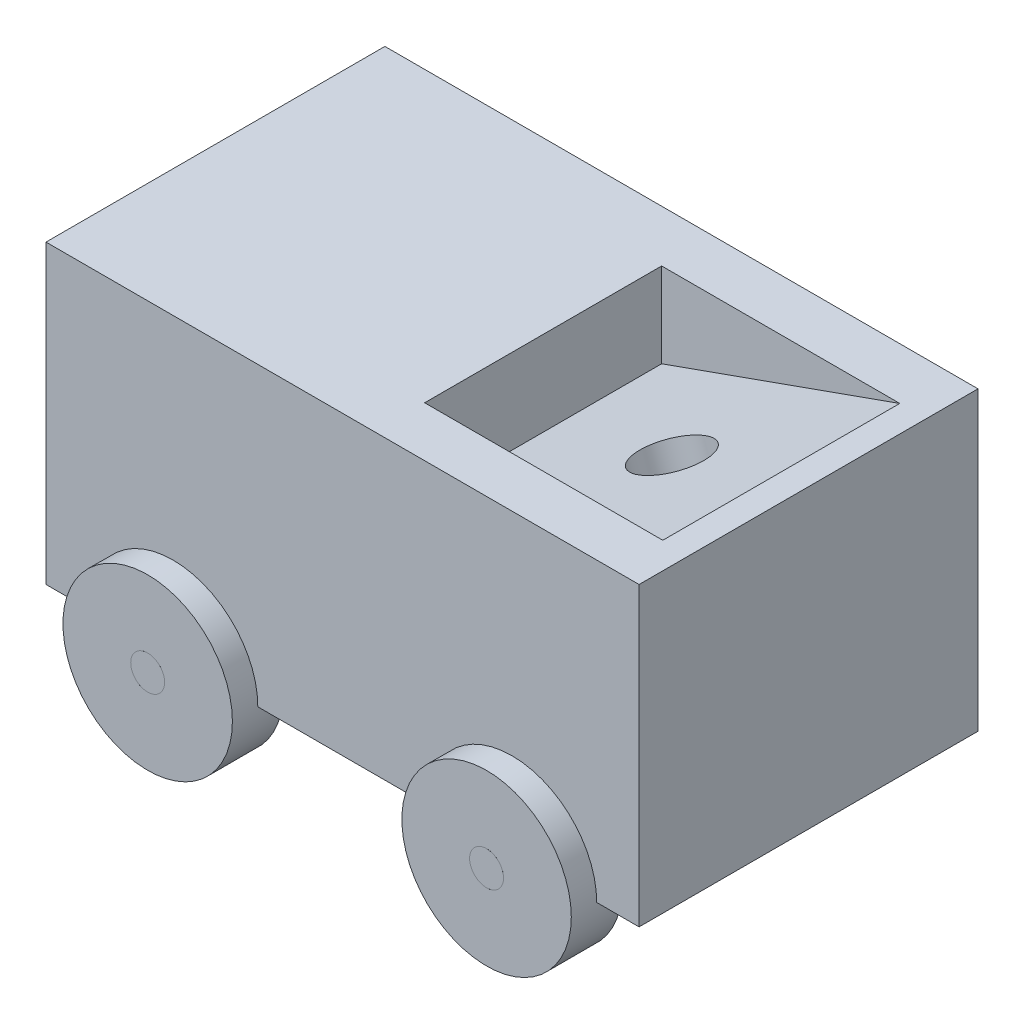
ISO-10303-21;
HEADER;
FILE_DESCRIPTION(('STEP AP214'),'2;1');
FILE_NAME('part.step','',(''),(''),'','','');
FILE_SCHEMA(('AUTOMOTIVE_DESIGN { 1 0 10303 214 1 1 1 1 }'));
ENDSEC;
DATA;
#1=APPLICATION_CONTEXT('core data for automotive mechanical design processes');
#2=APPLICATION_PROTOCOL_DEFINITION('international standard','automotive_design',2000,#1);
#3=PRODUCT_CONTEXT('',#1,'mechanical');
#4=PRODUCT('Part','Part','',(#3));
#5=PRODUCT_RELATED_PRODUCT_CATEGORY('part','',(#4));
#6=PRODUCT_DEFINITION_FORMATION('','',#4);
#7=PRODUCT_DEFINITION_CONTEXT('part definition',#1,'design');
#8=PRODUCT_DEFINITION('design','',#6,#7);
#9=PRODUCT_DEFINITION_SHAPE('','',#8);
#10=(LENGTH_UNIT() NAMED_UNIT(*) SI_UNIT(.MILLI.,.METRE.));
#11=(NAMED_UNIT(*) PLANE_ANGLE_UNIT() SI_UNIT($,.RADIAN.));
#12=(NAMED_UNIT(*) SI_UNIT($,.STERADIAN.) SOLID_ANGLE_UNIT());
#13=UNCERTAINTY_MEASURE_WITH_UNIT(LENGTH_MEASURE(1.E-05),#10,'distance_accuracy_value','');
#14=(GEOMETRIC_REPRESENTATION_CONTEXT(3) GLOBAL_UNCERTAINTY_ASSIGNED_CONTEXT((#13)) GLOBAL_UNIT_ASSIGNED_CONTEXT((#10,
#11,#12)) REPRESENTATION_CONTEXT('',''));
#15=CARTESIAN_POINT('',(0.,0.,0.));
#16=DIRECTION('',(0.,0.,1.));
#17=DIRECTION('',(1.,0.,0.));
#18=AXIS2_PLACEMENT_3D('',#15,#16,#17);
#19=CARTESIAN_POINT('',(-31.2286248123139,-10.,6.10846709352142));
#20=DIRECTION('',(0.,0.,-1.));
#21=DIRECTION('',(-1.,0.,0.));
#22=AXIS2_PLACEMENT_3D('',#19,#20,#21);
#23=PLANE('',#22);
#24=DIRECTION('',(-0.942142791010084,-0.335211815644569,0.));
#25=VECTOR('',#24,1.);
#26=CARTESIAN_POINT('',(-31.2286248123139,-10.,6.10846709352142));
#27=LINE('',#26,#25);
#28=CARTESIAN_POINT('',(-3.1227303587289,0.,6.10846709352142));
#29=VERTEX_POINT('',#28);
#30=CARTESIAN_POINT('',(-31.2286248123139,-10.,6.10846709352142));
#31=VERTEX_POINT('',#30);
#32=EDGE_CURVE('E192',#29,#31,#27,.T.);
#33=ORIENTED_EDGE('',*,*,#32,.F.);
#34=DIRECTION('',(-1.,0.,0.));
#35=VECTOR('',#34,1.);
#36=CARTESIAN_POINT('',(-31.2286248123139,0.,6.10846709352142));
#37=LINE('',#36,#35);
#38=CARTESIAN_POINT('',(-31.2286248123139,0.,6.10846709352142));
#39=VERTEX_POINT('',#38);
#40=EDGE_CURVE('E197',#29,#39,#37,.T.);
#41=ORIENTED_EDGE('',*,*,#40,.T.);
#42=DIRECTION('',(0.,1.,0.));
#43=VECTOR('',#42,1.);
#44=CARTESIAN_POINT('',(-31.2286248123139,-10.,6.10846709352142));
#45=LINE('',#44,#43);
#46=EDGE_CURVE('E182',#31,#39,#45,.T.);
#47=ORIENTED_EDGE('',*,*,#46,.F.);
#48=EDGE_LOOP('',(#33,#41,#47));
#49=FACE_BOUND('',#48,.T.);
#50=ADVANCED_FACE('F39',(#49),#23,.F.);
#51=CARTESIAN_POINT('',(-31.2286248123139,-10.,34.0804128909857));
#52=DIRECTION('',(0.,0.,1.));
#53=DIRECTION('',(1.,0.,0.));
#54=AXIS2_PLACEMENT_3D('',#51,#52,#53);
#55=PLANE('',#54);
#56=DIRECTION('',(0.942142791010084,0.335211815644569,0.));
#57=VECTOR('',#56,1.);
#58=CARTESIAN_POINT('',(-3.1227303587289,0.,34.0804128909857));
#59=LINE('',#58,#57);
#60=CARTESIAN_POINT('',(-31.2286248123139,-10.,34.0804128909857));
#61=VERTEX_POINT('',#60);
#62=CARTESIAN_POINT('',(-3.1227303587289,0.,34.0804128909857));
#63=VERTEX_POINT('',#62);
#64=EDGE_CURVE('E185',#61,#63,#59,.T.);
#65=ORIENTED_EDGE('',*,*,#64,.F.);
#66=DIRECTION('',(0.,1.,0.));
#67=VECTOR('',#66,1.);
#68=CARTESIAN_POINT('',(-31.2286248123139,-10.,34.0804128909857));
#69=LINE('',#68,#67);
#70=CARTESIAN_POINT('',(-31.2286248123139,0.,34.0804128909857));
#71=VERTEX_POINT('',#70);
#72=EDGE_CURVE('E171',#61,#71,#69,.T.);
#73=ORIENTED_EDGE('',*,*,#72,.T.);
#74=DIRECTION('',(1.,0.,0.));
#75=VECTOR('',#74,1.);
#76=CARTESIAN_POINT('',(-31.2286248123139,0.,34.0804128909857));
#77=LINE('',#76,#75);
#78=EDGE_CURVE('E187',#71,#63,#77,.T.);
#79=ORIENTED_EDGE('',*,*,#78,.T.);
#80=EDGE_LOOP('',(#65,#73,#79));
#81=FACE_BOUND('',#80,.T.);
#82=ADVANCED_FACE('F186',(#81),#55,.F.);
#83=CARTESIAN_POINT('',(0.,-35.,40.));
#84=DIRECTION('',(0.,1.,0.));
#85=DIRECTION('',(-1.,0.,0.));
#86=AXIS2_PLACEMENT_3D('',#83,#84,#85);
#87=PLANE('',#86);
#88=DIRECTION('',(1.,0.,0.));
#89=VECTOR('',#88,1.);
#90=CARTESIAN_POINT('',(0.,-35.,37.));
#91=LINE('',#90,#89);
#92=CARTESIAN_POINT('',(-13.,-35.,37.));
#93=VERTEX_POINT('',#92);
#94=CARTESIAN_POINT('',(-4.99999999999999,-35.,37.));
#95=VERTEX_POINT('',#94);
#96=EDGE_CURVE('E267',#93,#95,#91,.T.);
#97=ORIENTED_EDGE('',*,*,#96,.F.);
#98=DIRECTION('',(0.,0.,-1.));
#99=VECTOR('',#98,1.);
#100=CARTESIAN_POINT('',(-13.,-35.,43.));
#101=LINE('',#100,#99);
#102=CARTESIAN_POINT('',(-13.,-35.,3.));
#103=VERTEX_POINT('',#102);
#104=EDGE_CURVE('E384',#93,#103,#101,.T.);
#105=ORIENTED_EDGE('',*,*,#104,.T.);
#106=DIRECTION('',(-1.,0.,0.));
#107=VECTOR('',#106,1.);
#108=CARTESIAN_POINT('',(0.,-35.,3.));
#109=LINE('',#108,#107);
#110=CARTESIAN_POINT('',(-5.,-35.,3.));
#111=VERTEX_POINT('',#110);
#112=EDGE_CURVE('E11',#111,#103,#109,.T.);
#113=ORIENTED_EDGE('',*,*,#112,.F.);
#114=DIRECTION('',(0.,0.,-1.));
#115=VECTOR('',#114,1.);
#116=CARTESIAN_POINT('',(-5.,-35.,3.));
#117=LINE('',#116,#115);
#118=CARTESIAN_POINT('',(-5.,-35.,0.));
#119=VERTEX_POINT('',#118);
#120=EDGE_CURVE('E331',#111,#119,#117,.T.);
#121=ORIENTED_EDGE('',*,*,#120,.T.);
#122=DIRECTION('',(1.,0.,0.));
#123=VECTOR('',#122,1.);
#124=CARTESIAN_POINT('',(0.,-35.,0.));
#125=LINE('',#124,#123);
#126=CARTESIAN_POINT('',(0.,-35.,0.));
#127=VERTEX_POINT('',#126);
#128=EDGE_CURVE('E242',#119,#127,#125,.T.);
#129=ORIENTED_EDGE('',*,*,#128,.T.);
#130=DIRECTION('',(0.,0.,-1.));
#131=VECTOR('',#130,1.);
#132=CARTESIAN_POINT('',(0.,-35.,40.));
#133=LINE('',#132,#131);
#134=CARTESIAN_POINT('',(0.,-35.,40.));
#135=VERTEX_POINT('',#134);
#136=EDGE_CURVE('E231',#135,#127,#133,.T.);
#137=ORIENTED_EDGE('',*,*,#136,.F.);
#138=DIRECTION('',(1.,0.,0.));
#139=VECTOR('',#138,1.);
#140=CARTESIAN_POINT('',(0.,-35.,40.));
#141=LINE('',#140,#139);
#142=CARTESIAN_POINT('',(-4.99999999999999,-35.,40.));
#143=VERTEX_POINT('',#142);
#144=EDGE_CURVE('E227',#143,#135,#141,.T.);
#145=ORIENTED_EDGE('',*,*,#144,.F.);
#146=DIRECTION('',(0.,0.,1.));
#147=VECTOR('',#146,1.);
#148=CARTESIAN_POINT('',(-4.99999999999999,-35.,37.));
#149=LINE('',#148,#147);
#150=EDGE_CURVE('E350',#143,#95,#149,.F.);
#151=ORIENTED_EDGE('',*,*,#150,.T.);
#152=EDGE_LOOP('',(#97,#105,#113,#121,#129,#137,#145,#151));
#153=FACE_BOUND('',#152,.T.);
#154=ADVANCED_FACE('F372',(#153),#87,.F.);
#155=CARTESIAN_POINT('',(-17.,-35.,3.));
#156=VERTEX_POINT('',#155);
#157=CARTESIAN_POINT('',(-25.,-35.,3.));
#158=VERTEX_POINT('',#157);
#159=EDGE_CURVE('E48',#156,#158,#109,.T.);
#160=ORIENTED_EDGE('',*,*,#159,.F.);
#161=DIRECTION('',(0.,0.,-1.));
#162=VECTOR('',#161,1.);
#163=CARTESIAN_POINT('',(-17.,-35.,43.));
#164=LINE('',#163,#162);
#165=CARTESIAN_POINT('',(-17.,-35.,37.));
#166=VERTEX_POINT('',#165);
#167=EDGE_CURVE('E55',#156,#166,#164,.F.);
#168=ORIENTED_EDGE('',*,*,#167,.T.);
#169=CARTESIAN_POINT('',(-25.,-35.,37.));
#170=VERTEX_POINT('',#169);
#171=EDGE_CURVE('E268',#170,#166,#91,.T.);
#172=ORIENTED_EDGE('',*,*,#171,.F.);
#173=DIRECTION('',(0.,0.,1.));
#174=VECTOR('',#173,1.);
#175=CARTESIAN_POINT('',(-25.,-35.,37.));
#176=LINE('',#175,#174);
#177=CARTESIAN_POINT('',(-25.,-35.,40.));
#178=VERTEX_POINT('',#177);
#179=EDGE_CURVE('E205',#170,#178,#176,.T.);
#180=ORIENTED_EDGE('',*,*,#179,.T.);
#181=CARTESIAN_POINT('',(-45.,-35.,40.));
#182=VERTEX_POINT('',#181);
#183=EDGE_CURVE('E232',#182,#178,#141,.T.);
#184=ORIENTED_EDGE('',*,*,#183,.F.);
#185=DIRECTION('',(0.,0.,1.));
#186=VECTOR('',#185,1.);
#187=CARTESIAN_POINT('',(-45.,-35.,37.));
#188=LINE('',#187,#186);
#189=CARTESIAN_POINT('',(-45.,-35.,37.));
#190=VERTEX_POINT('',#189);
#191=EDGE_CURVE('E340',#182,#190,#188,.F.);
#192=ORIENTED_EDGE('',*,*,#191,.T.);
#193=DIRECTION('',(1.,0.,0.));
#194=VECTOR('',#193,1.);
#195=CARTESIAN_POINT('',(0.,-35.,37.));
#196=LINE('',#195,#194);
#197=CARTESIAN_POINT('',(-53.,-35.,37.));
#198=VERTEX_POINT('',#197);
#199=EDGE_CURVE('E262',#198,#190,#196,.T.);
#200=ORIENTED_EDGE('',*,*,#199,.F.);
#201=DIRECTION('',(0.,0.,-1.));
#202=VECTOR('',#201,1.);
#203=CARTESIAN_POINT('',(-53.,-35.,43.));
#204=LINE('',#203,#202);
#205=CARTESIAN_POINT('',(-53.,-35.,3.));
#206=VERTEX_POINT('',#205);
#207=EDGE_CURVE('E309',#198,#206,#204,.T.);
#208=ORIENTED_EDGE('',*,*,#207,.T.);
#209=DIRECTION('',(-1.,0.,0.));
#210=VECTOR('',#209,1.);
#211=CARTESIAN_POINT('',(0.,-35.,3.));
#212=LINE('',#211,#210);
#213=CARTESIAN_POINT('',(-45.,-35.,3.));
#214=VERTEX_POINT('',#213);
#215=EDGE_CURVE('E272',#214,#206,#212,.T.);
#216=ORIENTED_EDGE('',*,*,#215,.F.);
#217=DIRECTION('',(0.,0.,-1.));
#218=VECTOR('',#217,1.);
#219=CARTESIAN_POINT('',(-45.,-35.,3.));
#220=LINE('',#219,#218);
#221=CARTESIAN_POINT('',(-45.,-35.,0.));
#222=VERTEX_POINT('',#221);
#223=EDGE_CURVE('E293',#214,#222,#220,.T.);
#224=ORIENTED_EDGE('',*,*,#223,.T.);
#225=CARTESIAN_POINT('',(-25.,-35.,0.));
#226=VERTEX_POINT('',#225);
#227=EDGE_CURVE('E246',#222,#226,#125,.T.);
#228=ORIENTED_EDGE('',*,*,#227,.T.);
#229=DIRECTION('',(0.,0.,-1.));
#230=VECTOR('',#229,1.);
#231=CARTESIAN_POINT('',(-25.,-35.,3.));
#232=LINE('',#231,#230);
#233=EDGE_CURVE('E327',#226,#158,#232,.F.);
#234=ORIENTED_EDGE('',*,*,#233,.T.);
#235=EDGE_LOOP('',(#160,#168,#172,#180,#184,#192,#200,#208,#216,#224,#228,#234));
#236=FACE_BOUND('',#235,.T.);
#237=ADVANCED_FACE('F364',(#236),#87,.F.);
#238=CARTESIAN_POINT('',(0.,0.,40.));
#239=DIRECTION('',(-1.,0.,0.));
#240=DIRECTION('',(0.,-1.,0.));
#241=AXIS2_PLACEMENT_3D('',#238,#239,#240);
#242=PLANE('',#241);
#243=DIRECTION('',(0.,1.,0.));
#244=VECTOR('',#243,1.);
#245=CARTESIAN_POINT('',(0.,0.,0.));
#246=LINE('',#245,#244);
#247=CARTESIAN_POINT('',(0.,0.,0.));
#248=VERTEX_POINT('',#247);
#249=EDGE_CURVE('E214',#127,#248,#246,.T.);
#250=ORIENTED_EDGE('',*,*,#249,.T.);
#251=DIRECTION('',(0.,0.,-1.));
#252=VECTOR('',#251,1.);
#253=CARTESIAN_POINT('',(0.,0.,40.));
#254=LINE('',#253,#252);
#255=CARTESIAN_POINT('',(0.,0.,40.));
#256=VERTEX_POINT('',#255);
#257=EDGE_CURVE('E258',#256,#248,#254,.T.);
#258=ORIENTED_EDGE('',*,*,#257,.F.);
#259=DIRECTION('',(0.,1.,0.));
#260=VECTOR('',#259,1.);
#261=CARTESIAN_POINT('',(0.,0.,40.));
#262=LINE('',#261,#260);
#263=EDGE_CURVE('E216',#135,#256,#262,.T.);
#264=ORIENTED_EDGE('',*,*,#263,.F.);
#265=ORIENTED_EDGE('',*,*,#136,.T.);
#266=EDGE_LOOP('',(#250,#258,#264,#265));
#267=FACE_BOUND('',#266,.T.);
#268=ADVANCED_FACE('F41',(#267),#242,.F.);
#269=CARTESIAN_POINT('',(0.,0.,40.));
#270=DIRECTION('',(0.,-1.,0.));
#271=DIRECTION('',(0.,0.,-1.));
#272=AXIS2_PLACEMENT_3D('',#269,#270,#271);
#273=PLANE('',#272);
#274=ORIENTED_EDGE('',*,*,#40,.F.);
#275=DIRECTION('',(0.,0.,-1.));
#276=VECTOR('',#275,1.);
#277=CARTESIAN_POINT('',(-3.1227303587289,0.,34.0804128909857));
#278=LINE('',#277,#276);
#279=EDGE_CURVE('E201',#63,#29,#278,.T.);
#280=ORIENTED_EDGE('',*,*,#279,.F.);
#281=ORIENTED_EDGE('',*,*,#78,.F.);
#282=DIRECTION('',(0.,0.,1.));
#283=VECTOR('',#282,1.);
#284=CARTESIAN_POINT('',(-31.2286248123139,0.,34.0804128909857));
#285=LINE('',#284,#283);
#286=EDGE_CURVE('E178',#39,#71,#285,.T.);
#287=ORIENTED_EDGE('',*,*,#286,.F.);
#288=EDGE_LOOP('',(#274,#280,#281,#287));
#289=FACE_BOUND('',#288,.T.);
#290=DIRECTION('',(-1.,0.,0.));
#291=VECTOR('',#290,1.);
#292=CARTESIAN_POINT('',(0.,0.,0.));
#293=LINE('',#292,#291);
#294=CARTESIAN_POINT('',(-70.,0.,0.));
#295=VERTEX_POINT('',#294);
#296=EDGE_CURVE('E236',#248,#295,#293,.T.);
#297=ORIENTED_EDGE('',*,*,#296,.T.);
#298=DIRECTION('',(0.,0.,-1.));
#299=VECTOR('',#298,1.);
#300=CARTESIAN_POINT('',(-70.,0.,40.));
#301=LINE('',#300,#299);
#302=CARTESIAN_POINT('',(-70.,0.,40.));
#303=VERTEX_POINT('',#302);
#304=EDGE_CURVE('E254',#303,#295,#301,.T.);
#305=ORIENTED_EDGE('',*,*,#304,.F.);
#306=DIRECTION('',(-1.,0.,0.));
#307=VECTOR('',#306,1.);
#308=CARTESIAN_POINT('',(0.,0.,40.));
#309=LINE('',#308,#307);
#310=EDGE_CURVE('E220',#256,#303,#309,.T.);
#311=ORIENTED_EDGE('',*,*,#310,.F.);
#312=ORIENTED_EDGE('',*,*,#257,.T.);
#313=EDGE_LOOP('',(#297,#305,#311,#312));
#314=FACE_BOUND('',#313,.T.);
#315=ADVANCED_FACE('F455',(#289,#314),#273,.F.);
#316=CARTESIAN_POINT('',(-70.,0.,40.));
#317=DIRECTION('',(1.,0.,0.));
#318=DIRECTION('',(0.,0.,-1.));
#319=AXIS2_PLACEMENT_3D('',#316,#317,#318);
#320=PLANE('',#319);
#321=DIRECTION('',(0.,-1.,0.));
#322=VECTOR('',#321,1.);
#323=CARTESIAN_POINT('',(-70.,0.,0.));
#324=LINE('',#323,#322);
#325=CARTESIAN_POINT('',(-70.,-35.,0.));
#326=VERTEX_POINT('',#325);
#327=EDGE_CURVE('E239',#295,#326,#324,.T.);
#328=ORIENTED_EDGE('',*,*,#327,.T.);
#329=DIRECTION('',(0.,0.,-1.));
#330=VECTOR('',#329,1.);
#331=CARTESIAN_POINT('',(-70.,-35.,40.));
#332=LINE('',#331,#330);
#333=CARTESIAN_POINT('',(-70.,-35.,40.));
#334=VERTEX_POINT('',#333);
#335=EDGE_CURVE('E250',#334,#326,#332,.T.);
#336=ORIENTED_EDGE('',*,*,#335,.F.);
#337=DIRECTION('',(0.,-1.,0.));
#338=VECTOR('',#337,1.);
#339=CARTESIAN_POINT('',(-70.,0.,40.));
#340=LINE('',#339,#338);
#341=EDGE_CURVE('E224',#303,#334,#340,.T.);
#342=ORIENTED_EDGE('',*,*,#341,.F.);
#343=ORIENTED_EDGE('',*,*,#304,.T.);
#344=EDGE_LOOP('',(#328,#336,#342,#343));
#345=FACE_BOUND('',#344,.T.);
#346=ADVANCED_FACE('F456',(#345),#320,.F.);
#347=CARTESIAN_POINT('',(-57.,-35.,3.));
#348=VERTEX_POINT('',#347);
#349=CARTESIAN_POINT('',(-65.,-35.,3.));
#350=VERTEX_POINT('',#349);
#351=EDGE_CURVE('E271',#348,#350,#212,.T.);
#352=ORIENTED_EDGE('',*,*,#351,.F.);
#353=DIRECTION('',(0.,0.,-1.));
#354=VECTOR('',#353,1.);
#355=CARTESIAN_POINT('',(-57.,-35.,43.));
#356=LINE('',#355,#354);
#357=CARTESIAN_POINT('',(-57.,-35.,37.));
#358=VERTEX_POINT('',#357);
#359=EDGE_CURVE('E63',#348,#358,#356,.F.);
#360=ORIENTED_EDGE('',*,*,#359,.T.);
#361=CARTESIAN_POINT('',(-65.,-35.,37.));
#362=VERTEX_POINT('',#361);
#363=EDGE_CURVE('E263',#362,#358,#196,.T.);
#364=ORIENTED_EDGE('',*,*,#363,.F.);
#365=DIRECTION('',(0.,0.,1.));
#366=VECTOR('',#365,1.);
#367=CARTESIAN_POINT('',(-65.,-35.,37.));
#368=LINE('',#367,#366);
#369=CARTESIAN_POINT('',(-65.,-35.,40.));
#370=VERTEX_POINT('',#369);
#371=EDGE_CURVE('E347',#362,#370,#368,.T.);
#372=ORIENTED_EDGE('',*,*,#371,.T.);
#373=EDGE_CURVE('E228',#334,#370,#141,.T.);
#374=ORIENTED_EDGE('',*,*,#373,.F.);
#375=ORIENTED_EDGE('',*,*,#335,.T.);
#376=CARTESIAN_POINT('',(-65.,-35.,0.));
#377=VERTEX_POINT('',#376);
#378=EDGE_CURVE('E221',#326,#377,#125,.T.);
#379=ORIENTED_EDGE('',*,*,#378,.T.);
#380=DIRECTION('',(0.,0.,-1.));
#381=VECTOR('',#380,1.);
#382=CARTESIAN_POINT('',(-65.,-35.,3.));
#383=LINE('',#382,#381);
#384=EDGE_CURVE('E287',#377,#350,#383,.F.);
#385=ORIENTED_EDGE('',*,*,#384,.T.);
#386=EDGE_LOOP('',(#352,#360,#364,#372,#374,#375,#379,#385));
#387=FACE_BOUND('',#386,.T.);
#388=ADVANCED_FACE('F288',(#387),#87,.F.);
#389=CARTESIAN_POINT('',(0.,0.,40.));
#390=DIRECTION('',(0.,0.,-1.));
#391=DIRECTION('',(-1.,0.,0.));
#392=AXIS2_PLACEMENT_3D('',#389,#390,#391);
#393=PLANE('',#392);
#394=ORIENTED_EDGE('',*,*,#183,.T.);
#395=CARTESIAN_POINT('',(-15.,-35.,40.));
#396=DIRECTION('',(0.,0.,1.));
#397=DIRECTION('',(1.,0.,0.));
#398=AXIS2_PLACEMENT_3D('',#395,#396,#397);
#399=CIRCLE('',#398,10.);
#400=EDGE_CURVE('E336',#143,#178,#399,.T.);
#401=ORIENTED_EDGE('',*,*,#400,.F.);
#402=ORIENTED_EDGE('',*,*,#144,.T.);
#403=ORIENTED_EDGE('',*,*,#263,.T.);
#404=ORIENTED_EDGE('',*,*,#310,.T.);
#405=ORIENTED_EDGE('',*,*,#341,.T.);
#406=ORIENTED_EDGE('',*,*,#373,.T.);
#407=CARTESIAN_POINT('',(-55.,-35.,40.));
#408=DIRECTION('',(0.,0.,1.));
#409=DIRECTION('',(1.,0.,0.));
#410=AXIS2_PLACEMENT_3D('',#407,#408,#409);
#411=CIRCLE('',#410,10.);
#412=EDGE_CURVE('E335',#182,#370,#411,.T.);
#413=ORIENTED_EDGE('',*,*,#412,.F.);
#414=EDGE_LOOP('',(#394,#401,#402,#403,#404,#405,#406,#413));
#415=FACE_BOUND('',#414,.T.);
#416=ADVANCED_FACE('F370',(#415),#393,.F.);
#417=CARTESIAN_POINT('',(0.,0.,0.));
#418=DIRECTION('',(0.,0.,-1.));
#419=DIRECTION('',(-1.,0.,0.));
#420=AXIS2_PLACEMENT_3D('',#417,#418,#419);
#421=PLANE('',#420);
#422=CARTESIAN_POINT('',(-15.,-35.,0.));
#423=DIRECTION('',(0.,0.,-1.));
#424=DIRECTION('',(-1.,0.,0.));
#425=AXIS2_PLACEMENT_3D('',#422,#423,#424);
#426=CIRCLE('',#425,10.);
#427=EDGE_CURVE('E294',#226,#119,#426,.T.);
#428=ORIENTED_EDGE('',*,*,#427,.F.);
#429=ORIENTED_EDGE('',*,*,#227,.F.);
#430=CARTESIAN_POINT('',(-55.,-35.,0.));
#431=DIRECTION('',(0.,0.,-1.));
#432=DIRECTION('',(-1.,0.,0.));
#433=AXIS2_PLACEMENT_3D('',#430,#431,#432);
#434=CIRCLE('',#433,9.99999999999999);
#435=EDGE_CURVE('E319',#377,#222,#434,.T.);
#436=ORIENTED_EDGE('',*,*,#435,.F.);
#437=ORIENTED_EDGE('',*,*,#378,.F.);
#438=ORIENTED_EDGE('',*,*,#327,.F.);
#439=ORIENTED_EDGE('',*,*,#296,.F.);
#440=ORIENTED_EDGE('',*,*,#249,.F.);
#441=ORIENTED_EDGE('',*,*,#128,.F.);
#442=EDGE_LOOP('',(#428,#429,#436,#437,#438,#439,#440,#441));
#443=FACE_BOUND('',#442,.T.);
#444=ADVANCED_FACE('F446',(#443),#421,.T.);
#445=CARTESIAN_POINT('',(-31.2286248123139,-10.,34.0804128909857));
#446=DIRECTION('',(-1.,0.,0.));
#447=DIRECTION('',(0.,0.,1.));
#448=AXIS2_PLACEMENT_3D('',#445,#446,#447);
#449=PLANE('',#448);
#450=ORIENTED_EDGE('',*,*,#286,.T.);
#451=ORIENTED_EDGE('',*,*,#72,.F.);
#452=DIRECTION('',(0.,0.,1.));
#453=VECTOR('',#452,1.);
#454=CARTESIAN_POINT('',(-31.2286248123139,-10.,34.0804128909857));
#455=LINE('',#454,#453);
#456=EDGE_CURVE('E175',#31,#61,#455,.T.);
#457=ORIENTED_EDGE('',*,*,#456,.F.);
#458=ORIENTED_EDGE('',*,*,#46,.T.);
#459=EDGE_LOOP('',(#450,#451,#457,#458));
#460=FACE_BOUND('',#459,.T.);
#461=ADVANCED_FACE('F173',(#460),#449,.F.);
#462=CARTESIAN_POINT('',(-55.,-35.,37.));
#463=DIRECTION('',(0.,0.,1.));
#464=DIRECTION('',(1.,0.,0.));
#465=AXIS2_PLACEMENT_3D('',#462,#463,#464);
#466=CYLINDRICAL_SURFACE('',#465,10.);
#467=CARTESIAN_POINT('',(-55.,-35.,43.));
#468=DIRECTION('',(0.,0.,1.));
#469=DIRECTION('',(1.,0.,0.));
#470=AXIS2_PLACEMENT_3D('',#467,#468,#469);
#471=CIRCLE('',#470,10.);
#472=CARTESIAN_POINT('',(-45.,-35.,43.));
#473=VERTEX_POINT('',#472);
#474=EDGE_CURVE('E306',#473,#473,#471,.T.);
#475=ORIENTED_EDGE('',*,*,#474,.F.);
#476=EDGE_LOOP('',(#475));
#477=FACE_BOUND('',#476,.T.);
#478=ORIENTED_EDGE('',*,*,#371,.F.);
#479=CARTESIAN_POINT('',(-55.,-35.,37.));
#480=DIRECTION('',(0.,0.,1.));
#481=DIRECTION('',(1.,0.,0.));
#482=AXIS2_PLACEMENT_3D('',#479,#480,#481);
#483=CIRCLE('',#482,10.);
#484=EDGE_CURVE('E315',#362,#190,#483,.T.);
#485=ORIENTED_EDGE('',*,*,#484,.T.);
#486=ORIENTED_EDGE('',*,*,#191,.F.);
#487=ORIENTED_EDGE('',*,*,#412,.T.);
#488=EDGE_LOOP('',(#478,#485,#486,#487));
#489=FACE_BOUND('',#488,.T.);
#490=ADVANCED_FACE('F440',(#477,#489),#466,.T.);
#491=CARTESIAN_POINT('',(-55.,-35.,37.));
#492=DIRECTION('',(0.,0.,1.));
#493=DIRECTION('',(1.,0.,0.));
#494=AXIS2_PLACEMENT_3D('',#491,#492,#493);
#495=PLANE('',#494);
#496=ORIENTED_EDGE('',*,*,#363,.T.);
#497=CARTESIAN_POINT('',(-55.,-35.,37.));
#498=DIRECTION('',(0.,0.,1.));
#499=DIRECTION('',(1.,0.,0.));
#500=AXIS2_PLACEMENT_3D('',#497,#498,#499);
#501=CIRCLE('',#500,2.);
#502=EDGE_CURVE('E301',#358,#198,#501,.T.);
#503=ORIENTED_EDGE('',*,*,#502,.T.);
#504=ORIENTED_EDGE('',*,*,#199,.T.);
#505=ORIENTED_EDGE('',*,*,#484,.F.);
#506=EDGE_LOOP('',(#496,#503,#504,#505));
#507=FACE_BOUND('',#506,.T.);
#508=ADVANCED_FACE('F435',(#507),#495,.F.);
#509=CARTESIAN_POINT('',(-55.,-35.,43.));
#510=DIRECTION('',(0.,0.,1.));
#511=DIRECTION('',(1.,0.,0.));
#512=AXIS2_PLACEMENT_3D('',#509,#510,#511);
#513=PLANE('',#512);
#514=CARTESIAN_POINT('',(-55.,-35.,43.));
#515=DIRECTION('',(0.,0.,1.));
#516=DIRECTION('',(1.,0.,0.));
#517=AXIS2_PLACEMENT_3D('',#514,#515,#516);
#518=CIRCLE('',#517,2.);
#519=CARTESIAN_POINT('',(-53.,-35.,43.));
#520=VERTEX_POINT('',#519);
#521=EDGE_CURVE('E418',#520,#520,#518,.T.);
#522=ORIENTED_EDGE('',*,*,#521,.F.);
#523=EDGE_LOOP('',(#522));
#524=FACE_BOUND('',#523,.T.);
#525=ORIENTED_EDGE('',*,*,#474,.T.);
#526=EDGE_LOOP('',(#525));
#527=FACE_BOUND('',#526,.T.);
#528=ADVANCED_FACE('F661',(#524,#527),#513,.T.);
#529=CARTESIAN_POINT('',(-55.,-35.,-3.));
#530=DIRECTION('',(0.,0.,1.));
#531=DIRECTION('',(1.,0.,0.));
#532=AXIS2_PLACEMENT_3D('',#529,#530,#531);
#533=CYLINDRICAL_SURFACE('',#532,9.99999999999999);
#534=CARTESIAN_POINT('',(-55.,-35.,-3.));
#535=DIRECTION('',(0.,0.,-1.));
#536=DIRECTION('',(-1.,0.,0.));
#537=AXIS2_PLACEMENT_3D('',#534,#535,#536);
#538=CIRCLE('',#537,9.99999999999999);
#539=CARTESIAN_POINT('',(-65.,-35.,-3.));
#540=VERTEX_POINT('',#539);
#541=EDGE_CURVE('E300',#540,#540,#538,.T.);
#542=ORIENTED_EDGE('',*,*,#541,.F.);
#543=EDGE_LOOP('',(#542));
#544=FACE_BOUND('',#543,.T.);
#545=CARTESIAN_POINT('',(-55.,-35.,3.));
#546=DIRECTION('',(0.,0.,-1.));
#547=DIRECTION('',(-1.,0.,0.));
#548=AXIS2_PLACEMENT_3D('',#545,#546,#547);
#549=CIRCLE('',#548,9.99999999999999);
#550=EDGE_CURVE('E283',#214,#350,#549,.T.);
#551=ORIENTED_EDGE('',*,*,#550,.T.);
#552=ORIENTED_EDGE('',*,*,#384,.F.);
#553=ORIENTED_EDGE('',*,*,#435,.T.);
#554=ORIENTED_EDGE('',*,*,#223,.F.);
#555=EDGE_LOOP('',(#551,#552,#553,#554));
#556=FACE_BOUND('',#555,.T.);
#557=ADVANCED_FACE('F297',(#544,#556),#533,.T.);
#558=CARTESIAN_POINT('',(-55.,-35.,3.));
#559=DIRECTION('',(0.,0.,-1.));
#560=DIRECTION('',(-1.,0.,0.));
#561=AXIS2_PLACEMENT_3D('',#558,#559,#560);
#562=PLANE('',#561);
#563=ORIENTED_EDGE('',*,*,#215,.T.);
#564=CARTESIAN_POINT('',(-55.,-35.,3.));
#565=DIRECTION('',(0.,0.,-1.));
#566=DIRECTION('',(-1.,0.,0.));
#567=AXIS2_PLACEMENT_3D('',#564,#565,#566);
#568=CIRCLE('',#567,2.);
#569=EDGE_CURVE('E284',#206,#348,#568,.T.);
#570=ORIENTED_EDGE('',*,*,#569,.T.);
#571=ORIENTED_EDGE('',*,*,#351,.T.);
#572=ORIENTED_EDGE('',*,*,#550,.F.);
#573=EDGE_LOOP('',(#563,#570,#571,#572));
#574=FACE_BOUND('',#573,.T.);
#575=ADVANCED_FACE('F281',(#574),#562,.F.);
#576=CARTESIAN_POINT('',(-55.,-35.,-3.));
#577=DIRECTION('',(0.,0.,-1.));
#578=DIRECTION('',(-1.,0.,0.));
#579=AXIS2_PLACEMENT_3D('',#576,#577,#578);
#580=PLANE('',#579);
#581=CARTESIAN_POINT('',(-55.,-35.,-3.));
#582=DIRECTION('',(0.,0.,-1.));
#583=DIRECTION('',(-1.,0.,0.));
#584=AXIS2_PLACEMENT_3D('',#581,#582,#583);
#585=CIRCLE('',#584,2.);
#586=CARTESIAN_POINT('',(-57.,-35.,-3.));
#587=VERTEX_POINT('',#586);
#588=EDGE_CURVE('E422',#587,#587,#585,.T.);
#589=ORIENTED_EDGE('',*,*,#588,.F.);
#590=EDGE_LOOP('',(#589));
#591=FACE_BOUND('',#590,.T.);
#592=ORIENTED_EDGE('',*,*,#541,.T.);
#593=EDGE_LOOP('',(#592));
#594=FACE_BOUND('',#593,.T.);
#595=ADVANCED_FACE('F645',(#591,#594),#580,.T.);
#596=CARTESIAN_POINT('',(-55.,-35.,-3.0001));
#597=DIRECTION('',(0.,0.,-1.));
#598=DIRECTION('',(-1.,0.,0.));
#599=AXIS2_PLACEMENT_3D('',#596,#597,#598);
#600=PLANE('',#599);
#601=CARTESIAN_POINT('',(-55.,-35.,-3.0001));
#602=DIRECTION('',(0.,0.,-1.));
#603=DIRECTION('',(-1.,0.,0.));
#604=AXIS2_PLACEMENT_3D('',#601,#602,#603);
#605=CIRCLE('',#604,2.);
#606=CARTESIAN_POINT('',(-57.,-35.,-3.0001));
#607=VERTEX_POINT('',#606);
#608=EDGE_CURVE('E410',#607,#607,#605,.T.);
#609=ORIENTED_EDGE('',*,*,#608,.T.);
#610=EDGE_LOOP('',(#609));
#611=FACE_BOUND('',#610,.T.);
#612=ADVANCED_FACE('F641',(#611),#600,.T.);
#613=CARTESIAN_POINT('',(-55.,-35.,43.0001));
#614=DIRECTION('',(0.,0.,-1.));
#615=DIRECTION('',(-1.,0.,0.));
#616=AXIS2_PLACEMENT_3D('',#613,#614,#615);
#617=CYLINDRICAL_SURFACE('',#616,2.);
#618=ORIENTED_EDGE('',*,*,#588,.T.);
#619=EDGE_LOOP('',(#618));
#620=FACE_BOUND('',#619,.T.);
#621=ORIENTED_EDGE('',*,*,#608,.F.);
#622=EDGE_LOOP('',(#621));
#623=FACE_BOUND('',#622,.T.);
#624=ADVANCED_FACE('F644',(#620,#623),#617,.T.);
#625=ORIENTED_EDGE('',*,*,#502,.F.);
#626=ORIENTED_EDGE('',*,*,#359,.F.);
#627=ORIENTED_EDGE('',*,*,#569,.F.);
#628=ORIENTED_EDGE('',*,*,#207,.F.);
#629=EDGE_LOOP('',(#625,#626,#627,#628));
#630=FACE_BOUND('',#629,.T.);
#631=ADVANCED_FACE('F433',(#630),#617,.T.);
#632=ORIENTED_EDGE('',*,*,#521,.T.);
#633=EDGE_LOOP('',(#632));
#634=FACE_BOUND('',#633,.T.);
#635=CARTESIAN_POINT('',(-55.,-35.,43.0001));
#636=DIRECTION('',(0.,0.,-1.));
#637=DIRECTION('',(-1.,0.,0.));
#638=AXIS2_PLACEMENT_3D('',#635,#636,#637);
#639=CIRCLE('',#638,2.);
#640=CARTESIAN_POINT('',(-57.,-35.,43.0001));
#641=VERTEX_POINT('',#640);
#642=EDGE_CURVE('E414',#641,#641,#639,.T.);
#643=ORIENTED_EDGE('',*,*,#642,.T.);
#644=EDGE_LOOP('',(#643));
#645=FACE_BOUND('',#644,.T.);
#646=ADVANCED_FACE('F649',(#634,#645),#617,.T.);
#647=CARTESIAN_POINT('',(-55.,-35.,43.0001));
#648=DIRECTION('',(0.,0.,-1.));
#649=DIRECTION('',(-1.,0.,0.));
#650=AXIS2_PLACEMENT_3D('',#647,#648,#649);
#651=PLANE('',#650);
#652=ORIENTED_EDGE('',*,*,#642,.F.);
#653=EDGE_LOOP('',(#652));
#654=FACE_BOUND('',#653,.T.);
#655=ADVANCED_FACE('F639',(#654),#651,.F.);
#656=CARTESIAN_POINT('',(-15.,-35.,37.));
#657=DIRECTION('',(0.,0.,1.));
#658=DIRECTION('',(1.,0.,0.));
#659=AXIS2_PLACEMENT_3D('',#656,#657,#658);
#660=CYLINDRICAL_SURFACE('',#659,10.);
#661=CARTESIAN_POINT('',(-15.,-35.,43.));
#662=DIRECTION('',(0.,0.,1.));
#663=DIRECTION('',(1.,0.,0.));
#664=AXIS2_PLACEMENT_3D('',#661,#662,#663);
#665=CIRCLE('',#664,10.);
#666=CARTESIAN_POINT('',(-4.99999999999999,-35.,43.));
#667=VERTEX_POINT('',#666);
#668=EDGE_CURVE('E397',#667,#667,#665,.T.);
#669=ORIENTED_EDGE('',*,*,#668,.F.);
#670=EDGE_LOOP('',(#669));
#671=FACE_BOUND('',#670,.T.);
#672=ORIENTED_EDGE('',*,*,#179,.F.);
#673=CARTESIAN_POINT('',(-15.,-35.,37.));
#674=DIRECTION('',(0.,0.,1.));
#675=DIRECTION('',(1.,0.,0.));
#676=AXIS2_PLACEMENT_3D('',#673,#674,#675);
#677=CIRCLE('',#676,10.);
#678=EDGE_CURVE('E381',#170,#95,#677,.T.);
#679=ORIENTED_EDGE('',*,*,#678,.T.);
#680=ORIENTED_EDGE('',*,*,#150,.F.);
#681=ORIENTED_EDGE('',*,*,#400,.T.);
#682=EDGE_LOOP('',(#672,#679,#680,#681));
#683=FACE_BOUND('',#682,.T.);
#684=ADVANCED_FACE('F368',(#671,#683),#660,.T.);
#685=CARTESIAN_POINT('',(-15.,-35.,37.));
#686=DIRECTION('',(0.,0.,1.));
#687=DIRECTION('',(1.,0.,0.));
#688=AXIS2_PLACEMENT_3D('',#685,#686,#687);
#689=PLANE('',#688);
#690=ORIENTED_EDGE('',*,*,#171,.T.);
#691=CARTESIAN_POINT('',(-15.,-35.,37.));
#692=DIRECTION('',(0.,0.,1.));
#693=DIRECTION('',(1.,0.,0.));
#694=AXIS2_PLACEMENT_3D('',#691,#692,#693);
#695=CIRCLE('',#694,2.);
#696=EDGE_CURVE('E382',#166,#93,#695,.T.);
#697=ORIENTED_EDGE('',*,*,#696,.T.);
#698=ORIENTED_EDGE('',*,*,#96,.T.);
#699=ORIENTED_EDGE('',*,*,#678,.F.);
#700=EDGE_LOOP('',(#690,#697,#698,#699));
#701=FACE_BOUND('',#700,.T.);
#702=ADVANCED_FACE('F380',(#701),#689,.F.);
#703=CARTESIAN_POINT('',(-15.,-35.,43.));
#704=DIRECTION('',(0.,0.,1.));
#705=DIRECTION('',(1.,0.,0.));
#706=AXIS2_PLACEMENT_3D('',#703,#704,#705);
#707=PLANE('',#706);
#708=CARTESIAN_POINT('',(-15.,-35.,43.));
#709=DIRECTION('',(0.,0.,1.));
#710=DIRECTION('',(1.,0.,0.));
#711=AXIS2_PLACEMENT_3D('',#708,#709,#710);
#712=CIRCLE('',#711,2.);
#713=CARTESIAN_POINT('',(-13.,-35.,43.));
#714=VERTEX_POINT('',#713);
#715=EDGE_CURVE('E802',#714,#714,#712,.T.);
#716=ORIENTED_EDGE('',*,*,#715,.F.);
#717=EDGE_LOOP('',(#716));
#718=FACE_BOUND('',#717,.T.);
#719=ORIENTED_EDGE('',*,*,#668,.T.);
#720=EDGE_LOOP('',(#719));
#721=FACE_BOUND('',#720,.T.);
#722=ADVANCED_FACE('F499',(#718,#721),#707,.T.);
#723=CARTESIAN_POINT('',(-15.,-35.,3.));
#724=DIRECTION('',(0.,0.,-1.));
#725=DIRECTION('',(-1.,0.,0.));
#726=AXIS2_PLACEMENT_3D('',#723,#724,#725);
#727=CYLINDRICAL_SURFACE('',#726,10.);
#728=CARTESIAN_POINT('',(-15.,-35.,-3.));
#729=DIRECTION('',(0.,0.,-1.));
#730=DIRECTION('',(-1.,0.,0.));
#731=AXIS2_PLACEMENT_3D('',#728,#729,#730);
#732=CIRCLE('',#731,10.);
#733=CARTESIAN_POINT('',(-25.,-35.,-3.));
#734=VERTEX_POINT('',#733);
#735=EDGE_CURVE('E398',#734,#734,#732,.T.);
#736=ORIENTED_EDGE('',*,*,#735,.F.);
#737=EDGE_LOOP('',(#736));
#738=FACE_BOUND('',#737,.T.);
#739=ORIENTED_EDGE('',*,*,#120,.F.);
#740=CARTESIAN_POINT('',(-15.,-35.,3.));
#741=DIRECTION('',(0.,0.,-1.));
#742=DIRECTION('',(-1.,0.,0.));
#743=AXIS2_PLACEMENT_3D('',#740,#741,#742);
#744=CIRCLE('',#743,10.);
#745=EDGE_CURVE('E393',#111,#158,#744,.T.);
#746=ORIENTED_EDGE('',*,*,#745,.T.);
#747=ORIENTED_EDGE('',*,*,#233,.F.);
#748=ORIENTED_EDGE('',*,*,#427,.T.);
#749=EDGE_LOOP('',(#739,#746,#747,#748));
#750=FACE_BOUND('',#749,.T.);
#751=ADVANCED_FACE('F494',(#738,#750),#727,.T.);
#752=CARTESIAN_POINT('',(-15.,-35.,3.));
#753=DIRECTION('',(0.,0.,-1.));
#754=DIRECTION('',(-1.,0.,0.));
#755=AXIS2_PLACEMENT_3D('',#752,#753,#754);
#756=PLANE('',#755);
#757=ORIENTED_EDGE('',*,*,#112,.T.);
#758=CARTESIAN_POINT('',(-15.,-35.,3.));
#759=DIRECTION('',(0.,0.,-1.));
#760=DIRECTION('',(-1.,0.,0.));
#761=AXIS2_PLACEMENT_3D('',#758,#759,#760);
#762=CIRCLE('',#761,2.);
#763=EDGE_CURVE('E391',#103,#156,#762,.T.);
#764=ORIENTED_EDGE('',*,*,#763,.T.);
#765=ORIENTED_EDGE('',*,*,#159,.T.);
#766=ORIENTED_EDGE('',*,*,#745,.F.);
#767=EDGE_LOOP('',(#757,#764,#765,#766));
#768=FACE_BOUND('',#767,.T.);
#769=ADVANCED_FACE('F390',(#768),#756,.F.);
#770=CARTESIAN_POINT('',(-15.,-35.,-3.));
#771=DIRECTION('',(0.,0.,-1.));
#772=DIRECTION('',(-1.,0.,0.));
#773=AXIS2_PLACEMENT_3D('',#770,#771,#772);
#774=PLANE('',#773);
#775=CARTESIAN_POINT('',(-15.,-35.,-3.));
#776=DIRECTION('',(0.,0.,-1.));
#777=DIRECTION('',(-1.,0.,0.));
#778=AXIS2_PLACEMENT_3D('',#775,#776,#777);
#779=CIRCLE('',#778,2.);
#780=CARTESIAN_POINT('',(-17.,-35.,-3.));
#781=VERTEX_POINT('',#780);
#782=EDGE_CURVE('E806',#781,#781,#779,.T.);
#783=ORIENTED_EDGE('',*,*,#782,.F.);
#784=EDGE_LOOP('',(#783));
#785=FACE_BOUND('',#784,.T.);
#786=ORIENTED_EDGE('',*,*,#735,.T.);
#787=EDGE_LOOP('',(#786));
#788=FACE_BOUND('',#787,.T.);
#789=ADVANCED_FACE('F518',(#785,#788),#774,.T.);
#790=CARTESIAN_POINT('',(-15.,-35.,-3.001));
#791=DIRECTION('',(0.,0.,-1.));
#792=DIRECTION('',(-1.,0.,0.));
#793=AXIS2_PLACEMENT_3D('',#790,#791,#792);
#794=PLANE('',#793);
#795=CARTESIAN_POINT('',(-15.,-35.,-3.001));
#796=DIRECTION('',(0.,0.,-1.));
#797=DIRECTION('',(-1.,0.,0.));
#798=AXIS2_PLACEMENT_3D('',#795,#796,#797);
#799=CIRCLE('',#798,2.);
#800=CARTESIAN_POINT('',(-17.,-35.,-3.001));
#801=VERTEX_POINT('',#800);
#802=EDGE_CURVE('E794',#801,#801,#799,.T.);
#803=ORIENTED_EDGE('',*,*,#802,.T.);
#804=EDGE_LOOP('',(#803));
#805=FACE_BOUND('',#804,.T.);
#806=ADVANCED_FACE('F523',(#805),#794,.T.);
#807=CARTESIAN_POINT('',(-15.,-35.,43.001));
#808=DIRECTION('',(0.,0.,-1.));
#809=DIRECTION('',(-1.,0.,0.));
#810=AXIS2_PLACEMENT_3D('',#807,#808,#809);
#811=CYLINDRICAL_SURFACE('',#810,2.);
#812=ORIENTED_EDGE('',*,*,#782,.T.);
#813=EDGE_LOOP('',(#812));
#814=FACE_BOUND('',#813,.T.);
#815=ORIENTED_EDGE('',*,*,#802,.F.);
#816=EDGE_LOOP('',(#815));
#817=FACE_BOUND('',#816,.T.);
#818=ADVANCED_FACE('F558',(#814,#817),#811,.T.);
#819=ORIENTED_EDGE('',*,*,#696,.F.);
#820=ORIENTED_EDGE('',*,*,#167,.F.);
#821=ORIENTED_EDGE('',*,*,#763,.F.);
#822=ORIENTED_EDGE('',*,*,#104,.F.);
#823=EDGE_LOOP('',(#819,#820,#821,#822));
#824=FACE_BOUND('',#823,.T.);
#825=ADVANCED_FACE('F568',(#824),#811,.T.);
#826=ORIENTED_EDGE('',*,*,#715,.T.);
#827=EDGE_LOOP('',(#826));
#828=FACE_BOUND('',#827,.T.);
#829=CARTESIAN_POINT('',(-15.,-35.,43.001));
#830=DIRECTION('',(0.,0.,-1.));
#831=DIRECTION('',(-1.,0.,0.));
#832=AXIS2_PLACEMENT_3D('',#829,#830,#831);
#833=CIRCLE('',#832,2.);
#834=CARTESIAN_POINT('',(-17.,-35.,43.001));
#835=VERTEX_POINT('',#834);
#836=EDGE_CURVE('E798',#835,#835,#833,.T.);
#837=ORIENTED_EDGE('',*,*,#836,.T.);
#838=EDGE_LOOP('',(#837));
#839=FACE_BOUND('',#838,.T.);
#840=ADVANCED_FACE('F571',(#828,#839),#811,.T.);
#841=CARTESIAN_POINT('',(-15.,-35.,43.001));
#842=DIRECTION('',(0.,0.,-1.));
#843=DIRECTION('',(-1.,0.,0.));
#844=AXIS2_PLACEMENT_3D('',#841,#842,#843);
#845=PLANE('',#844);
#846=ORIENTED_EDGE('',*,*,#836,.F.);
#847=EDGE_LOOP('',(#846));
#848=FACE_BOUND('',#847,.T.);
#849=ADVANCED_FACE('F585',(#848),#845,.F.);
#850=CARTESIAN_POINT('',(-3.1227303587289,0.,6.08041289098572));
#851=DIRECTION('',(0.335211815644569,-0.942142791010084,0.));
#852=DIRECTION('',(0.942142791010084,0.335211815644569,0.));
#853=AXIS2_PLACEMENT_3D('',#850,#851,#852);
#854=PLANE('',#853);
#855=CARTESIAN_POINT('',(-15.777848312409,-4.50265618643773,20.3525356370449));
#856=DIRECTION('',(-0.335211815644569,0.942142791010084,0.));
#857=DIRECTION('',(-0.942142791010084,-0.335211815644569,0.));
#858=AXIS2_PLACEMENT_3D('',#855,#856,#857);
#859=CIRCLE('',#858,4.);
#860=CARTESIAN_POINT('',(-19.5464194764493,-5.84350344901601,20.3525356370449));
#861=VERTEX_POINT('',#860);
#862=EDGE_CURVE('E786',#861,#861,#859,.T.);
#863=ORIENTED_EDGE('',*,*,#862,.F.);
#864=EDGE_LOOP('',(#863));
#865=FACE_BOUND('',#864,.T.);
#866=ORIENTED_EDGE('',*,*,#279,.T.);
#867=ORIENTED_EDGE('',*,*,#32,.T.);
#868=ORIENTED_EDGE('',*,*,#456,.T.);
#869=ORIENTED_EDGE('',*,*,#64,.T.);
#870=EDGE_LOOP('',(#866,#867,#868,#869));
#871=FACE_BOUND('',#870,.T.);
#872=ADVANCED_FACE('F195',(#865,#871),#854,.F.);
#873=CARTESIAN_POINT('',(-12.4257301559633,-13.9240840965386,20.3525356370449));
#874=DIRECTION('',(-0.335211815644569,0.942142791010084,0.));
#875=DIRECTION('',(-0.942142791010084,-0.335211815644569,0.));
#876=AXIS2_PLACEMENT_3D('',#873,#874,#875);
#877=CYLINDRICAL_SURFACE('',#876,4.);
#878=CARTESIAN_POINT('',(-12.4257301559633,-13.9240840965386,20.3525356370449));
#879=DIRECTION('',(-0.335211815644569,0.942142791010084,0.));
#880=DIRECTION('',(-0.942142791010084,-0.335211815644569,0.));
#881=AXIS2_PLACEMENT_3D('',#878,#879,#880);
#882=CIRCLE('',#881,4.);
#883=CARTESIAN_POINT('',(-16.1943013200036,-15.2649313591169,20.3525356370449));
#884=VERTEX_POINT('',#883);
#885=EDGE_CURVE('E193',#884,#884,#882,.T.);
#886=ORIENTED_EDGE('',*,*,#885,.F.);
#887=EDGE_LOOP('',(#886));
#888=FACE_BOUND('',#887,.T.);
#889=ORIENTED_EDGE('',*,*,#862,.T.);
#890=EDGE_LOOP('',(#889));
#891=FACE_BOUND('',#890,.T.);
#892=ADVANCED_FACE('F612',(#888,#891),#877,.F.);
#893=CARTESIAN_POINT('',(-12.4257301559633,-13.9240840965386,20.3525356370449));
#894=DIRECTION('',(-0.335211815644569,0.942142791010084,0.));
#895=DIRECTION('',(-0.942142791010084,-0.335211815644569,0.));
#896=AXIS2_PLACEMENT_3D('',#893,#894,#895);
#897=PLANE('',#896);
#898=ORIENTED_EDGE('',*,*,#885,.T.);
#899=EDGE_LOOP('',(#898));
#900=FACE_BOUND('',#899,.T.);
#901=ADVANCED_FACE('F619',(#900),#897,.T.);
#902=CLOSED_SHELL('',(#50,#82,#154,#237,#268,#315,#346,#388,#416,#444,#461,#490,#508,#528,#557,
#575,#595,#612,#624,#631,#646,#655,#684,#702,#722,#751,#769,#789,#806,#818,#825,#840,#849,#872,
#892,#901));
#903=MANIFOLD_SOLID_BREP('B2',#902);
#904=ADVANCED_BREP_SHAPE_REPRESENTATION('',(#18,#903),#14);
#905=SHAPE_DEFINITION_REPRESENTATION(#9,#904);
ENDSEC;
END-ISO-10303-21;
